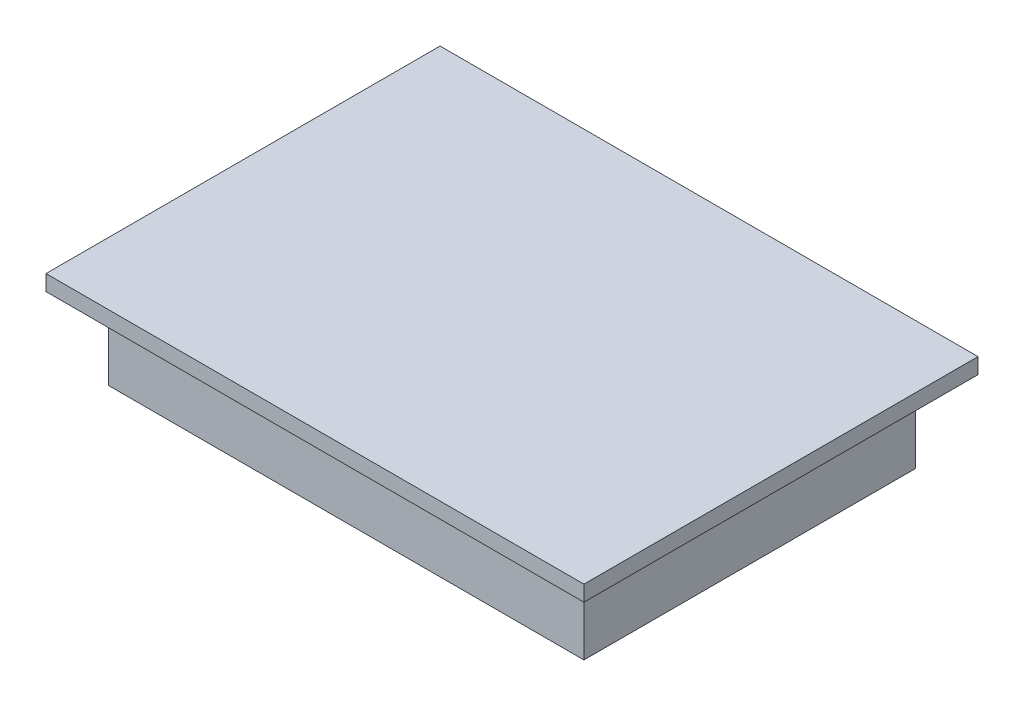
ISO-10303-21;
HEADER;
FILE_DESCRIPTION(('STEP AP214'),'2;1');
FILE_NAME('part.step','',(''),(''),'','','');
FILE_SCHEMA(('AUTOMOTIVE_DESIGN { 1 0 10303 214 1 1 1 1 }'));
ENDSEC;
DATA;
#1=APPLICATION_CONTEXT('core data for automotive mechanical design processes');
#2=APPLICATION_PROTOCOL_DEFINITION('international standard','automotive_design',2000,#1);
#3=PRODUCT_CONTEXT('',#1,'mechanical');
#4=PRODUCT('Part','Part','',(#3));
#5=PRODUCT_RELATED_PRODUCT_CATEGORY('part','',(#4));
#6=PRODUCT_DEFINITION_FORMATION('','',#4);
#7=PRODUCT_DEFINITION_CONTEXT('part definition',#1,'design');
#8=PRODUCT_DEFINITION('design','',#6,#7);
#9=PRODUCT_DEFINITION_SHAPE('','',#8);
#10=(LENGTH_UNIT() NAMED_UNIT(*) SI_UNIT(.MILLI.,.METRE.));
#11=(NAMED_UNIT(*) PLANE_ANGLE_UNIT() SI_UNIT($,.RADIAN.));
#12=(NAMED_UNIT(*) SI_UNIT($,.STERADIAN.) SOLID_ANGLE_UNIT());
#13=UNCERTAINTY_MEASURE_WITH_UNIT(LENGTH_MEASURE(1.E-05),#10,'distance_accuracy_value','');
#14=(GEOMETRIC_REPRESENTATION_CONTEXT(3) GLOBAL_UNCERTAINTY_ASSIGNED_CONTEXT((#13)) GLOBAL_UNIT_ASSIGNED_CONTEXT((#10,
#11,#12)) REPRESENTATION_CONTEXT('',''));
#15=CARTESIAN_POINT('',(0.,0.,0.));
#16=DIRECTION('',(0.,0.,1.));
#17=DIRECTION('',(1.,0.,0.));
#18=AXIS2_PLACEMENT_3D('',#15,#16,#17);
#19=CARTESIAN_POINT('',(38.,13.,26.5));
#20=DIRECTION('',(-1.,0.,0.));
#21=DIRECTION('',(0.,0.,1.));
#22=AXIS2_PLACEMENT_3D('',#19,#20,#21);
#23=PLANE('',#22);
#24=DIRECTION('',(0.,0.,-1.));
#25=VECTOR('',#24,1.);
#26=CARTESIAN_POINT('',(38.,0.,26.5));
#27=LINE('',#26,#25);
#28=CARTESIAN_POINT('',(38.,0.,26.5));
#29=VERTEX_POINT('',#28);
#30=CARTESIAN_POINT('',(38.,0.,-26.5));
#31=VERTEX_POINT('',#30);
#32=EDGE_CURVE('E135',#29,#31,#27,.T.);
#33=ORIENTED_EDGE('',*,*,#32,.T.);
#34=DIRECTION('',(0.,-1.,0.));
#35=VECTOR('',#34,1.);
#36=CARTESIAN_POINT('',(38.,13.,-26.5));
#37=LINE('',#36,#35);
#38=CARTESIAN_POINT('',(38.,13.,-26.5));
#39=VERTEX_POINT('',#38);
#40=EDGE_CURVE('E11',#39,#31,#37,.T.);
#41=ORIENTED_EDGE('',*,*,#40,.F.);
#42=DIRECTION('',(0.,0.,-1.));
#43=VECTOR('',#42,1.);
#44=CARTESIAN_POINT('',(38.,13.,26.5));
#45=LINE('',#44,#43);
#46=CARTESIAN_POINT('',(38.,13.,26.5));
#47=VERTEX_POINT('',#46);
#48=EDGE_CURVE('E144',#47,#39,#45,.T.);
#49=ORIENTED_EDGE('',*,*,#48,.F.);
#50=DIRECTION('',(0.,-1.,0.));
#51=VECTOR('',#50,1.);
#52=CARTESIAN_POINT('',(38.,13.,26.5));
#53=LINE('',#52,#51);
#54=EDGE_CURVE('E153',#47,#29,#53,.T.);
#55=ORIENTED_EDGE('',*,*,#54,.T.);
#56=EDGE_LOOP('',(#33,#41,#49,#55));
#57=FACE_BOUND('',#56,.T.);
#58=ADVANCED_FACE('F37',(#57),#23,.F.);
#59=CARTESIAN_POINT('',(-38.,13.,-26.5));
#60=DIRECTION('',(0.,0.,1.));
#61=DIRECTION('',(1.,0.,0.));
#62=AXIS2_PLACEMENT_3D('',#59,#60,#61);
#63=PLANE('',#62);
#64=DIRECTION('',(-1.,0.,0.));
#65=VECTOR('',#64,1.);
#66=CARTESIAN_POINT('',(-38.,0.,-26.5));
#67=LINE('',#66,#65);
#68=CARTESIAN_POINT('',(-38.,0.,-26.5));
#69=VERTEX_POINT('',#68);
#70=EDGE_CURVE('E138',#31,#69,#67,.T.);
#71=ORIENTED_EDGE('',*,*,#70,.T.);
#72=DIRECTION('',(0.,-1.,0.));
#73=VECTOR('',#72,1.);
#74=CARTESIAN_POINT('',(-38.,13.,-26.5));
#75=LINE('',#74,#73);
#76=CARTESIAN_POINT('',(-38.,13.,-26.5));
#77=VERTEX_POINT('',#76);
#78=EDGE_CURVE('E45',#77,#69,#75,.T.);
#79=ORIENTED_EDGE('',*,*,#78,.F.);
#80=DIRECTION('',(-1.,0.,0.));
#81=VECTOR('',#80,1.);
#82=CARTESIAN_POINT('',(-38.,13.,-26.5));
#83=LINE('',#82,#81);
#84=EDGE_CURVE('E79',#39,#77,#83,.T.);
#85=ORIENTED_EDGE('',*,*,#84,.F.);
#86=ORIENTED_EDGE('',*,*,#40,.T.);
#87=EDGE_LOOP('',(#71,#79,#85,#86));
#88=FACE_BOUND('',#87,.T.);
#89=ADVANCED_FACE('F197',(#88),#63,.F.);
#90=CARTESIAN_POINT('',(-38.,13.,26.5));
#91=DIRECTION('',(1.,0.,0.));
#92=DIRECTION('',(0.,0.,-1.));
#93=AXIS2_PLACEMENT_3D('',#90,#91,#92);
#94=PLANE('',#93);
#95=DIRECTION('',(0.,0.,1.));
#96=VECTOR('',#95,1.);
#97=CARTESIAN_POINT('',(-38.,0.,26.5));
#98=LINE('',#97,#96);
#99=CARTESIAN_POINT('',(-38.,0.,26.5));
#100=VERTEX_POINT('',#99);
#101=EDGE_CURVE('E69',#69,#100,#98,.T.);
#102=ORIENTED_EDGE('',*,*,#101,.T.);
#103=DIRECTION('',(0.,-1.,0.));
#104=VECTOR('',#103,1.);
#105=CARTESIAN_POINT('',(-38.,13.,26.5));
#106=LINE('',#105,#104);
#107=CARTESIAN_POINT('',(-38.,13.,26.5));
#108=VERTEX_POINT('',#107);
#109=EDGE_CURVE('E53',#108,#100,#106,.T.);
#110=ORIENTED_EDGE('',*,*,#109,.F.);
#111=DIRECTION('',(0.,0.,1.));
#112=VECTOR('',#111,1.);
#113=CARTESIAN_POINT('',(-38.,13.,26.5));
#114=LINE('',#113,#112);
#115=EDGE_CURVE('E148',#77,#108,#114,.T.);
#116=ORIENTED_EDGE('',*,*,#115,.F.);
#117=ORIENTED_EDGE('',*,*,#78,.T.);
#118=EDGE_LOOP('',(#102,#110,#116,#117));
#119=FACE_BOUND('',#118,.T.);
#120=ADVANCED_FACE('F159',(#119),#94,.F.);
#121=CARTESIAN_POINT('',(-38.,13.,26.5));
#122=DIRECTION('',(0.,0.,-1.));
#123=DIRECTION('',(-1.,0.,0.));
#124=AXIS2_PLACEMENT_3D('',#121,#122,#123);
#125=PLANE('',#124);
#126=DIRECTION('',(1.,0.,0.));
#127=VECTOR('',#126,1.);
#128=CARTESIAN_POINT('',(-38.,0.,26.5));
#129=LINE('',#128,#127);
#130=EDGE_CURVE('E74',#100,#29,#129,.T.);
#131=ORIENTED_EDGE('',*,*,#130,.T.);
#132=ORIENTED_EDGE('',*,*,#54,.F.);
#133=DIRECTION('',(1.,0.,0.));
#134=VECTOR('',#133,1.);
#135=CARTESIAN_POINT('',(-38.,13.,26.5));
#136=LINE('',#135,#134);
#137=EDGE_CURVE('E151',#108,#47,#136,.T.);
#138=ORIENTED_EDGE('',*,*,#137,.F.);
#139=ORIENTED_EDGE('',*,*,#109,.T.);
#140=EDGE_LOOP('',(#131,#132,#138,#139));
#141=FACE_BOUND('',#140,.T.);
#142=ADVANCED_FACE('F164',(#141),#125,.F.);
#143=CARTESIAN_POINT('',(0.,0.,0.));
#144=DIRECTION('',(0.,-1.,0.));
#145=DIRECTION('',(0.,0.,-1.));
#146=AXIS2_PLACEMENT_3D('',#143,#144,#145);
#147=PLANE('',#146);
#148=ORIENTED_EDGE('',*,*,#32,.F.);
#149=ORIENTED_EDGE('',*,*,#130,.F.);
#150=ORIENTED_EDGE('',*,*,#101,.F.);
#151=ORIENTED_EDGE('',*,*,#70,.F.);
#152=EDGE_LOOP('',(#148,#149,#150,#151));
#153=FACE_BOUND('',#152,.T.);
#154=ADVANCED_FACE('F162',(#153),#147,.T.);
#155=CARTESIAN_POINT('',(43.,15.5,31.5));
#156=DIRECTION('',(-1.,0.,0.));
#157=DIRECTION('',(0.,0.,1.));
#158=AXIS2_PLACEMENT_3D('',#155,#156,#157);
#159=PLANE('',#158);
#160=DIRECTION('',(0.,0.,-1.));
#161=VECTOR('',#160,1.);
#162=CARTESIAN_POINT('',(43.,13.,31.5));
#163=LINE('',#162,#161);
#164=CARTESIAN_POINT('',(43.,13.,31.5));
#165=VERTEX_POINT('',#164);
#166=CARTESIAN_POINT('',(43.,13.,-31.5));
#167=VERTEX_POINT('',#166);
#168=EDGE_CURVE('E134',#165,#167,#163,.T.);
#169=ORIENTED_EDGE('',*,*,#168,.T.);
#170=DIRECTION('',(0.,-1.,0.));
#171=VECTOR('',#170,1.);
#172=CARTESIAN_POINT('',(43.,15.5,-31.5));
#173=LINE('',#172,#171);
#174=CARTESIAN_POINT('',(43.,15.5,-31.5));
#175=VERTEX_POINT('',#174);
#176=EDGE_CURVE('E114',#175,#167,#173,.T.);
#177=ORIENTED_EDGE('',*,*,#176,.F.);
#178=DIRECTION('',(0.,0.,-1.));
#179=VECTOR('',#178,1.);
#180=CARTESIAN_POINT('',(43.,15.5,31.5));
#181=LINE('',#180,#179);
#182=CARTESIAN_POINT('',(43.,15.5,31.5));
#183=VERTEX_POINT('',#182);
#184=EDGE_CURVE('E121',#183,#175,#181,.T.);
#185=ORIENTED_EDGE('',*,*,#184,.F.);
#186=DIRECTION('',(0.,-1.,0.));
#187=VECTOR('',#186,1.);
#188=CARTESIAN_POINT('',(43.,15.5,31.5));
#189=LINE('',#188,#187);
#190=EDGE_CURVE('E181',#183,#165,#189,.T.);
#191=ORIENTED_EDGE('',*,*,#190,.T.);
#192=EDGE_LOOP('',(#169,#177,#185,#191));
#193=FACE_BOUND('',#192,.T.);
#194=ADVANCED_FACE('F132',(#193),#159,.F.);
#195=CARTESIAN_POINT('',(-43.,15.5,-31.5));
#196=DIRECTION('',(0.,0.,1.));
#197=DIRECTION('',(1.,0.,0.));
#198=AXIS2_PLACEMENT_3D('',#195,#196,#197);
#199=PLANE('',#198);
#200=DIRECTION('',(-1.,0.,0.));
#201=VECTOR('',#200,1.);
#202=CARTESIAN_POINT('',(-43.,13.,-31.5));
#203=LINE('',#202,#201);
#204=CARTESIAN_POINT('',(-43.,13.,-31.5));
#205=VERTEX_POINT('',#204);
#206=EDGE_CURVE('E172',#167,#205,#203,.T.);
#207=ORIENTED_EDGE('',*,*,#206,.T.);
#208=DIRECTION('',(0.,-1.,0.));
#209=VECTOR('',#208,1.);
#210=CARTESIAN_POINT('',(-43.,15.5,-31.5));
#211=LINE('',#210,#209);
#212=CARTESIAN_POINT('',(-43.,15.5,-31.5));
#213=VERTEX_POINT('',#212);
#214=EDGE_CURVE('E117',#213,#205,#211,.T.);
#215=ORIENTED_EDGE('',*,*,#214,.F.);
#216=DIRECTION('',(-1.,0.,0.));
#217=VECTOR('',#216,1.);
#218=CARTESIAN_POINT('',(-43.,15.5,-31.5));
#219=LINE('',#218,#217);
#220=EDGE_CURVE('E110',#175,#213,#219,.T.);
#221=ORIENTED_EDGE('',*,*,#220,.F.);
#222=ORIENTED_EDGE('',*,*,#176,.T.);
#223=EDGE_LOOP('',(#207,#215,#221,#222));
#224=FACE_BOUND('',#223,.T.);
#225=ADVANCED_FACE('F112',(#224),#199,.F.);
#226=CARTESIAN_POINT('',(-43.,15.5,31.5));
#227=DIRECTION('',(1.,0.,0.));
#228=DIRECTION('',(0.,0.,-1.));
#229=AXIS2_PLACEMENT_3D('',#226,#227,#228);
#230=PLANE('',#229);
#231=DIRECTION('',(0.,0.,1.));
#232=VECTOR('',#231,1.);
#233=CARTESIAN_POINT('',(-43.,13.,31.5));
#234=LINE('',#233,#232);
#235=CARTESIAN_POINT('',(-43.,13.,31.5));
#236=VERTEX_POINT('',#235);
#237=EDGE_CURVE('E174',#205,#236,#234,.T.);
#238=ORIENTED_EDGE('',*,*,#237,.T.);
#239=DIRECTION('',(0.,-1.,0.));
#240=VECTOR('',#239,1.);
#241=CARTESIAN_POINT('',(-43.,15.5,31.5));
#242=LINE('',#241,#240);
#243=CARTESIAN_POINT('',(-43.,15.5,31.5));
#244=VERTEX_POINT('',#243);
#245=EDGE_CURVE('E140',#244,#236,#242,.T.);
#246=ORIENTED_EDGE('',*,*,#245,.F.);
#247=DIRECTION('',(0.,0.,1.));
#248=VECTOR('',#247,1.);
#249=CARTESIAN_POINT('',(-43.,15.5,31.5));
#250=LINE('',#249,#248);
#251=EDGE_CURVE('E120',#213,#244,#250,.T.);
#252=ORIENTED_EDGE('',*,*,#251,.F.);
#253=ORIENTED_EDGE('',*,*,#214,.T.);
#254=EDGE_LOOP('',(#238,#246,#252,#253));
#255=FACE_BOUND('',#254,.T.);
#256=ADVANCED_FACE('F187',(#255),#230,.F.);
#257=CARTESIAN_POINT('',(-43.,15.5,31.5));
#258=DIRECTION('',(0.,0.,-1.));
#259=DIRECTION('',(-1.,0.,0.));
#260=AXIS2_PLACEMENT_3D('',#257,#258,#259);
#261=PLANE('',#260);
#262=DIRECTION('',(1.,0.,0.));
#263=VECTOR('',#262,1.);
#264=CARTESIAN_POINT('',(-43.,13.,31.5));
#265=LINE('',#264,#263);
#266=EDGE_CURVE('E130',#236,#165,#265,.T.);
#267=ORIENTED_EDGE('',*,*,#266,.T.);
#268=ORIENTED_EDGE('',*,*,#190,.F.);
#269=DIRECTION('',(1.,0.,0.));
#270=VECTOR('',#269,1.);
#271=CARTESIAN_POINT('',(-43.,15.5,31.5));
#272=LINE('',#271,#270);
#273=EDGE_CURVE('E126',#244,#183,#272,.T.);
#274=ORIENTED_EDGE('',*,*,#273,.F.);
#275=ORIENTED_EDGE('',*,*,#245,.T.);
#276=EDGE_LOOP('',(#267,#268,#274,#275));
#277=FACE_BOUND('',#276,.T.);
#278=ADVANCED_FACE('F185',(#277),#261,.F.);
#279=CARTESIAN_POINT('',(0.,15.5,0.));
#280=DIRECTION('',(0.,-1.,0.));
#281=DIRECTION('',(0.,0.,-1.));
#282=AXIS2_PLACEMENT_3D('',#279,#280,#281);
#283=PLANE('',#282);
#284=ORIENTED_EDGE('',*,*,#184,.T.);
#285=ORIENTED_EDGE('',*,*,#220,.T.);
#286=ORIENTED_EDGE('',*,*,#251,.T.);
#287=ORIENTED_EDGE('',*,*,#273,.T.);
#288=EDGE_LOOP('',(#284,#285,#286,#287));
#289=FACE_BOUND('',#288,.T.);
#290=ADVANCED_FACE('F124',(#289),#283,.F.);
#291=CARTESIAN_POINT('',(0.,13.,0.));
#292=DIRECTION('',(0.,-1.,0.));
#293=DIRECTION('',(0.,0.,-1.));
#294=AXIS2_PLACEMENT_3D('',#291,#292,#293);
#295=PLANE('',#294);
#296=ORIENTED_EDGE('',*,*,#137,.T.);
#297=ORIENTED_EDGE('',*,*,#48,.T.);
#298=ORIENTED_EDGE('',*,*,#84,.T.);
#299=ORIENTED_EDGE('',*,*,#115,.T.);
#300=EDGE_LOOP('',(#296,#297,#298,#299));
#301=FACE_BOUND('',#300,.T.);
#302=ORIENTED_EDGE('',*,*,#168,.F.);
#303=ORIENTED_EDGE('',*,*,#266,.F.);
#304=ORIENTED_EDGE('',*,*,#237,.F.);
#305=ORIENTED_EDGE('',*,*,#206,.F.);
#306=EDGE_LOOP('',(#302,#303,#304,#305));
#307=FACE_BOUND('',#306,.T.);
#308=ADVANCED_FACE('F166',(#301,#307),#295,.T.);
#309=CLOSED_SHELL('',(#58,#89,#120,#142,#154,#194,#225,#256,#278,#290,#308));
#310=MANIFOLD_SOLID_BREP('B2',#309);
#311=ADVANCED_BREP_SHAPE_REPRESENTATION('',(#18,#310),#14);
#312=SHAPE_DEFINITION_REPRESENTATION(#9,#311);
ENDSEC;
END-ISO-10303-21;
